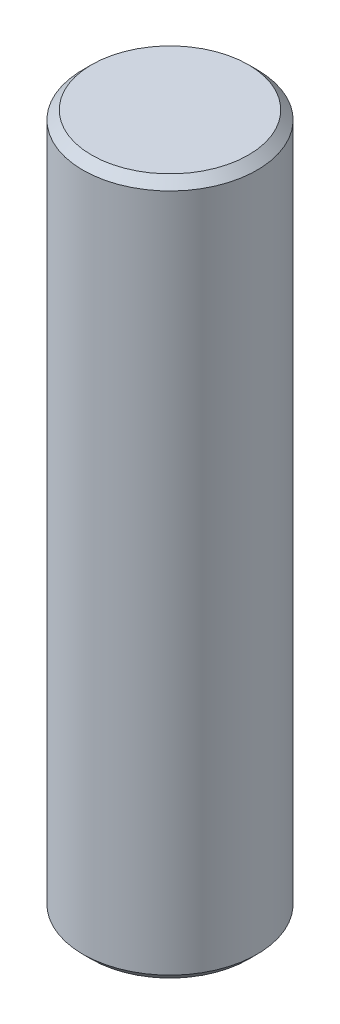
ISO-10303-21;
HEADER;
FILE_DESCRIPTION(('STEP AP214'),'2;1');
FILE_NAME('part.step','',(''),(''),'','','');
FILE_SCHEMA(('AUTOMOTIVE_DESIGN { 1 0 10303 214 1 1 1 1 }'));
ENDSEC;
DATA;
#1=APPLICATION_CONTEXT('core data for automotive mechanical design processes');
#2=APPLICATION_PROTOCOL_DEFINITION('international standard','automotive_design',2000,#1);
#3=PRODUCT_CONTEXT('',#1,'mechanical');
#4=PRODUCT('Part','Part','',(#3));
#5=PRODUCT_RELATED_PRODUCT_CATEGORY('part','',(#4));
#6=PRODUCT_DEFINITION_FORMATION('','',#4);
#7=PRODUCT_DEFINITION_CONTEXT('part definition',#1,'design');
#8=PRODUCT_DEFINITION('design','',#6,#7);
#9=PRODUCT_DEFINITION_SHAPE('','',#8);
#10=(LENGTH_UNIT() NAMED_UNIT(*) SI_UNIT(.MILLI.,.METRE.));
#11=(NAMED_UNIT(*) PLANE_ANGLE_UNIT() SI_UNIT($,.RADIAN.));
#12=(NAMED_UNIT(*) SI_UNIT($,.STERADIAN.) SOLID_ANGLE_UNIT());
#13=UNCERTAINTY_MEASURE_WITH_UNIT(LENGTH_MEASURE(1.E-05),#10,'distance_accuracy_value','');
#14=(GEOMETRIC_REPRESENTATION_CONTEXT(3) GLOBAL_UNCERTAINTY_ASSIGNED_CONTEXT((#13)) GLOBAL_UNIT_ASSIGNED_CONTEXT((#10,
#11,#12)) REPRESENTATION_CONTEXT('',''));
#15=CARTESIAN_POINT('',(0.,0.,0.));
#16=DIRECTION('',(0.,0.,1.));
#17=DIRECTION('',(1.,0.,0.));
#18=AXIS2_PLACEMENT_3D('',#15,#16,#17);
#19=CARTESIAN_POINT('',(0.,4.,0.));
#20=DIRECTION('',(0.,-1.,0.));
#21=DIRECTION('',(0.,0.,-1.));
#22=AXIS2_PLACEMENT_3D('',#19,#20,#21);
#23=CYLINDRICAL_SURFACE('',#22,1.);
#24=CARTESIAN_POINT('',(0.,-3.9,0.));
#25=DIRECTION('',(0.,1.,0.));
#26=DIRECTION('',(0.,0.,1.));
#27=AXIS2_PLACEMENT_3D('',#24,#25,#26);
#28=CIRCLE('',#27,1.);
#29=CARTESIAN_POINT('',(0.,-3.9,1.));
#30=VERTEX_POINT('',#29);
#31=EDGE_CURVE('E45',#30,#30,#28,.T.);
#32=ORIENTED_EDGE('',*,*,#31,.T.);
#33=EDGE_LOOP('',(#32));
#34=FACE_BOUND('',#33,.T.);
#35=CARTESIAN_POINT('',(0.,3.9,0.));
#36=DIRECTION('',(0.,1.,0.));
#37=DIRECTION('',(0.,0.,1.));
#38=AXIS2_PLACEMENT_3D('',#35,#36,#37);
#39=CIRCLE('',#38,1.);
#40=CARTESIAN_POINT('',(0.,3.9,1.));
#41=VERTEX_POINT('',#40);
#42=EDGE_CURVE('E49',#41,#41,#39,.F.);
#43=ORIENTED_EDGE('',*,*,#42,.T.);
#44=EDGE_LOOP('',(#43));
#45=FACE_BOUND('',#44,.T.);
#46=ADVANCED_FACE('F33',(#34,#45),#23,.T.);
#47=CARTESIAN_POINT('',(0.,4.,0.));
#48=DIRECTION('',(0.,1.,0.));
#49=DIRECTION('',(0.,0.,1.));
#50=AXIS2_PLACEMENT_3D('',#47,#48,#49);
#51=PLANE('',#50);
#52=CARTESIAN_POINT('',(0.,4.,0.));
#53=DIRECTION('',(0.,1.,0.));
#54=DIRECTION('',(0.,0.,1.));
#55=AXIS2_PLACEMENT_3D('',#52,#53,#54);
#56=CIRCLE('',#55,0.9);
#57=CARTESIAN_POINT('',(0.,4.,0.9));
#58=VERTEX_POINT('',#57);
#59=EDGE_CURVE('E10',#58,#58,#56,.T.);
#60=ORIENTED_EDGE('',*,*,#59,.T.);
#61=EDGE_LOOP('',(#60));
#62=FACE_BOUND('',#61,.T.);
#63=ADVANCED_FACE('F65',(#62),#51,.T.);
#64=CARTESIAN_POINT('',(0.,-4.,0.));
#65=DIRECTION('',(0.,1.,0.));
#66=DIRECTION('',(0.,0.,1.));
#67=AXIS2_PLACEMENT_3D('',#64,#65,#66);
#68=PLANE('',#67);
#69=CARTESIAN_POINT('',(0.,-4.,0.));
#70=DIRECTION('',(0.,1.,0.));
#71=DIRECTION('',(0.,0.,1.));
#72=AXIS2_PLACEMENT_3D('',#69,#70,#71);
#73=CIRCLE('',#72,0.899999999999999);
#74=CARTESIAN_POINT('',(0.,-4.,0.899999999999999));
#75=VERTEX_POINT('',#74);
#76=EDGE_CURVE('E41',#75,#75,#73,.F.);
#77=ORIENTED_EDGE('',*,*,#76,.T.);
#78=EDGE_LOOP('',(#77));
#79=FACE_BOUND('',#78,.T.);
#80=ADVANCED_FACE('F62',(#79),#68,.F.);
#81=CARTESIAN_POINT('',(0.,-3.9,0.));
#82=DIRECTION('',(0.,1.,0.));
#83=DIRECTION('',(0.,0.,1.));
#84=AXIS2_PLACEMENT_3D('',#81,#82,#83);
#85=CONICAL_SURFACE('',#84,1.,0.78539816339744);
#86=ORIENTED_EDGE('',*,*,#76,.F.);
#87=EDGE_LOOP('',(#86));
#88=FACE_BOUND('',#87,.T.);
#89=ORIENTED_EDGE('',*,*,#31,.F.);
#90=EDGE_LOOP('',(#89));
#91=FACE_BOUND('',#90,.T.);
#92=ADVANCED_FACE('F58',(#88,#91),#85,.T.);
#93=CARTESIAN_POINT('',(0.,4.,0.));
#94=DIRECTION('',(0.,-1.,0.));
#95=DIRECTION('',(0.,0.,-1.));
#96=AXIS2_PLACEMENT_3D('',#93,#94,#95);
#97=CONICAL_SURFACE('',#96,0.9,0.785398163397448);
#98=ORIENTED_EDGE('',*,*,#42,.F.);
#99=EDGE_LOOP('',(#98));
#100=FACE_BOUND('',#99,.T.);
#101=ORIENTED_EDGE('',*,*,#59,.F.);
#102=EDGE_LOOP('',(#101));
#103=FACE_BOUND('',#102,.T.);
#104=ADVANCED_FACE('F36',(#100,#103),#97,.T.);
#105=CLOSED_SHELL('',(#46,#63,#80,#92,#104));
#106=MANIFOLD_SOLID_BREP('B2',#105);
#107=ADVANCED_BREP_SHAPE_REPRESENTATION('',(#18,#106),#14);
#108=SHAPE_DEFINITION_REPRESENTATION(#9,#107);
ENDSEC;
END-ISO-10303-21;
